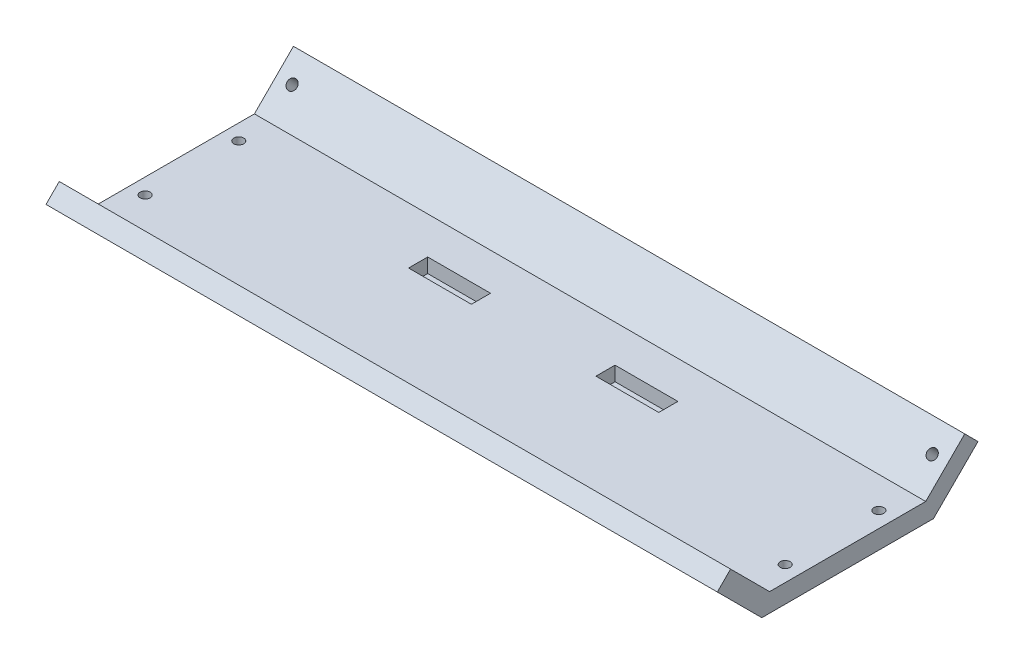
ISO-10303-21;
HEADER;
FILE_DESCRIPTION(('STEP AP214'),'2;1');
FILE_NAME('part.step','',(''),(''),'','','');
FILE_SCHEMA(('AUTOMOTIVE_DESIGN { 1 0 10303 214 1 1 1 1 }'));
ENDSEC;
DATA;
#1=APPLICATION_CONTEXT('core data for automotive mechanical design processes');
#2=APPLICATION_PROTOCOL_DEFINITION('international standard','automotive_design',2000,#1);
#3=PRODUCT_CONTEXT('',#1,'mechanical');
#4=PRODUCT('Part','Part','',(#3));
#5=PRODUCT_RELATED_PRODUCT_CATEGORY('part','',(#4));
#6=PRODUCT_DEFINITION_FORMATION('','',#4);
#7=PRODUCT_DEFINITION_CONTEXT('part definition',#1,'design');
#8=PRODUCT_DEFINITION('design','',#6,#7);
#9=PRODUCT_DEFINITION_SHAPE('','',#8);
#10=(LENGTH_UNIT() NAMED_UNIT(*) SI_UNIT(.MILLI.,.METRE.));
#11=(NAMED_UNIT(*) PLANE_ANGLE_UNIT() SI_UNIT($,.RADIAN.));
#12=(NAMED_UNIT(*) SI_UNIT($,.STERADIAN.) SOLID_ANGLE_UNIT());
#13=UNCERTAINTY_MEASURE_WITH_UNIT(LENGTH_MEASURE(1.E-05),#10,'distance_accuracy_value','');
#14=(GEOMETRIC_REPRESENTATION_CONTEXT(3) GLOBAL_UNCERTAINTY_ASSIGNED_CONTEXT((#13)) GLOBAL_UNIT_ASSIGNED_CONTEXT((#10,
#11,#12)) REPRESENTATION_CONTEXT('',''));
#15=CARTESIAN_POINT('',(0.,0.,0.));
#16=DIRECTION('',(0.,0.,1.));
#17=DIRECTION('',(1.,0.,0.));
#18=AXIS2_PLACEMENT_3D('',#15,#16,#17);
#19=CARTESIAN_POINT('',(-19.9375,-6.,-13.0625));
#20=DIRECTION('',(1.,0.,0.));
#21=DIRECTION('',(0.,0.,-1.));
#22=AXIS2_PLACEMENT_3D('',#19,#20,#21);
#23=PLANE('',#22);
#24=DIRECTION('',(0.,0.,1.));
#25=VECTOR('',#24,1.);
#26=CARTESIAN_POINT('',(-19.9375,-4.6,-13.0625));
#27=LINE('',#26,#25);
#28=CARTESIAN_POINT('',(-19.9375,-4.6,-13.0625));
#29=VERTEX_POINT('',#28);
#30=CARTESIAN_POINT('',(-19.9375,-4.6,-6.9375));
#31=VERTEX_POINT('',#30);
#32=EDGE_CURVE('E54',#29,#31,#27,.T.);
#33=ORIENTED_EDGE('',*,*,#32,.T.);
#34=DIRECTION('',(0.,1.,0.));
#35=VECTOR('',#34,1.);
#36=CARTESIAN_POINT('',(-19.9375,-6.,-6.9375));
#37=LINE('',#36,#35);
#38=CARTESIAN_POINT('',(-19.9375,0.,-6.9375));
#39=VERTEX_POINT('',#38);
#40=EDGE_CURVE('E184',#31,#39,#37,.T.);
#41=ORIENTED_EDGE('',*,*,#40,.T.);
#42=DIRECTION('',(0.,0.,-1.));
#43=VECTOR('',#42,1.);
#44=CARTESIAN_POINT('',(-19.9375,0.,-13.0625));
#45=LINE('',#44,#43);
#46=CARTESIAN_POINT('',(-19.9375,0.,-13.0625));
#47=VERTEX_POINT('',#46);
#48=EDGE_CURVE('E189',#39,#47,#45,.T.);
#49=ORIENTED_EDGE('',*,*,#48,.T.);
#50=DIRECTION('',(0.,1.,0.));
#51=VECTOR('',#50,1.);
#52=CARTESIAN_POINT('',(-19.9375,-6.,-13.0625));
#53=LINE('',#52,#51);
#54=EDGE_CURVE('E162',#29,#47,#53,.T.);
#55=ORIENTED_EDGE('',*,*,#54,.F.);
#56=EDGE_LOOP('',(#33,#41,#49,#55));
#57=FACE_BOUND('',#56,.T.);
#58=ADVANCED_FACE('F39',(#57),#23,.F.);
#59=CARTESIAN_POINT('',(-40.0625,-6.,-6.9375));
#60=DIRECTION('',(0.,0.,1.));
#61=DIRECTION('',(0.,-1.,0.));
#62=AXIS2_PLACEMENT_3D('',#59,#60,#61);
#63=PLANE('',#62);
#64=DIRECTION('',(-1.,0.,0.));
#65=VECTOR('',#64,1.);
#66=CARTESIAN_POINT('',(-19.9375,-4.6,-6.9375));
#67=LINE('',#66,#65);
#68=CARTESIAN_POINT('',(-40.0625,-4.6,-6.9375));
#69=VERTEX_POINT('',#68);
#70=EDGE_CURVE('E61',#31,#69,#67,.T.);
#71=ORIENTED_EDGE('',*,*,#70,.T.);
#72=DIRECTION('',(0.,1.,0.));
#73=VECTOR('',#72,1.);
#74=CARTESIAN_POINT('',(-40.0625,-6.,-6.9375));
#75=LINE('',#74,#73);
#76=CARTESIAN_POINT('',(-40.0625,0.,-6.9375));
#77=VERTEX_POINT('',#76);
#78=EDGE_CURVE('E163',#69,#77,#75,.T.);
#79=ORIENTED_EDGE('',*,*,#78,.T.);
#80=DIRECTION('',(1.,0.,0.));
#81=VECTOR('',#80,1.);
#82=CARTESIAN_POINT('',(-40.0625,0.,-6.9375));
#83=LINE('',#82,#81);
#84=EDGE_CURVE('E207',#77,#39,#83,.T.);
#85=ORIENTED_EDGE('',*,*,#84,.T.);
#86=ORIENTED_EDGE('',*,*,#40,.F.);
#87=EDGE_LOOP('',(#71,#79,#85,#86));
#88=FACE_BOUND('',#87,.T.);
#89=ADVANCED_FACE('F373',(#88),#63,.F.);
#90=CARTESIAN_POINT('',(-40.0625,-6.,-13.0625));
#91=DIRECTION('',(-1.,0.,0.));
#92=DIRECTION('',(0.,0.,1.));
#93=AXIS2_PLACEMENT_3D('',#90,#91,#92);
#94=PLANE('',#93);
#95=DIRECTION('',(0.,0.,-1.));
#96=VECTOR('',#95,1.);
#97=CARTESIAN_POINT('',(-40.0625,-4.6,-13.0625));
#98=LINE('',#97,#96);
#99=CARTESIAN_POINT('',(-40.0625,-4.6,-13.0625));
#100=VERTEX_POINT('',#99);
#101=EDGE_CURVE('E166',#69,#100,#98,.T.);
#102=ORIENTED_EDGE('',*,*,#101,.T.);
#103=DIRECTION('',(0.,1.,0.));
#104=VECTOR('',#103,1.);
#105=CARTESIAN_POINT('',(-40.0625,-6.,-13.0625));
#106=LINE('',#105,#104);
#107=CARTESIAN_POINT('',(-40.0625,0.,-13.0625));
#108=VERTEX_POINT('',#107);
#109=EDGE_CURVE('E152',#100,#108,#106,.T.);
#110=ORIENTED_EDGE('',*,*,#109,.T.);
#111=DIRECTION('',(0.,0.,1.));
#112=VECTOR('',#111,1.);
#113=CARTESIAN_POINT('',(-40.0625,0.,-13.0625));
#114=LINE('',#113,#112);
#115=EDGE_CURVE('E213',#108,#77,#114,.T.);
#116=ORIENTED_EDGE('',*,*,#115,.T.);
#117=ORIENTED_EDGE('',*,*,#78,.F.);
#118=EDGE_LOOP('',(#102,#110,#116,#117));
#119=FACE_BOUND('',#118,.T.);
#120=ADVANCED_FACE('F167',(#119),#94,.F.);
#121=CARTESIAN_POINT('',(-40.0625,-6.,-13.0625));
#122=DIRECTION('',(0.,0.,-1.));
#123=DIRECTION('',(0.,1.,0.));
#124=AXIS2_PLACEMENT_3D('',#121,#122,#123);
#125=PLANE('',#124);
#126=DIRECTION('',(1.,0.,0.));
#127=VECTOR('',#126,1.);
#128=CARTESIAN_POINT('',(-19.9375,-4.6,-13.0625));
#129=LINE('',#128,#127);
#130=EDGE_CURVE('E156',#100,#29,#129,.T.);
#131=ORIENTED_EDGE('',*,*,#130,.T.);
#132=ORIENTED_EDGE('',*,*,#54,.T.);
#133=DIRECTION('',(-1.,0.,0.));
#134=VECTOR('',#133,1.);
#135=CARTESIAN_POINT('',(-40.0625,0.,-13.0625));
#136=LINE('',#135,#134);
#137=EDGE_CURVE('E158',#47,#108,#136,.T.);
#138=ORIENTED_EDGE('',*,*,#137,.T.);
#139=ORIENTED_EDGE('',*,*,#109,.F.);
#140=EDGE_LOOP('',(#131,#132,#138,#139));
#141=FACE_BOUND('',#140,.T.);
#142=ADVANCED_FACE('F154',(#141),#125,.F.);
#143=CARTESIAN_POINT('',(40.0625,-6.,-13.0625));
#144=DIRECTION('',(1.,0.,0.));
#145=DIRECTION('',(0.,0.,-1.));
#146=AXIS2_PLACEMENT_3D('',#143,#144,#145);
#147=PLANE('',#146);
#148=DIRECTION('',(0.,0.,1.));
#149=VECTOR('',#148,1.);
#150=CARTESIAN_POINT('',(40.0625,-4.6,-13.0625));
#151=LINE('',#150,#149);
#152=CARTESIAN_POINT('',(40.0625,-4.6,-13.0625));
#153=VERTEX_POINT('',#152);
#154=CARTESIAN_POINT('',(40.0625,-4.6,-6.9375));
#155=VERTEX_POINT('',#154);
#156=EDGE_CURVE('E175',#153,#155,#151,.T.);
#157=ORIENTED_EDGE('',*,*,#156,.T.);
#158=DIRECTION('',(0.,1.,0.));
#159=VECTOR('',#158,1.);
#160=CARTESIAN_POINT('',(40.0625,-6.,-6.9375));
#161=LINE('',#160,#159);
#162=CARTESIAN_POINT('',(40.0625,0.,-6.9375));
#163=VERTEX_POINT('',#162);
#164=EDGE_CURVE('E199',#155,#163,#161,.T.);
#165=ORIENTED_EDGE('',*,*,#164,.T.);
#166=DIRECTION('',(0.,0.,-1.));
#167=VECTOR('',#166,1.);
#168=CARTESIAN_POINT('',(40.0625,0.,-13.0625));
#169=LINE('',#168,#167);
#170=CARTESIAN_POINT('',(40.0625,0.,-13.0625));
#171=VERTEX_POINT('',#170);
#172=EDGE_CURVE('E185',#163,#171,#169,.T.);
#173=ORIENTED_EDGE('',*,*,#172,.T.);
#174=DIRECTION('',(0.,1.,0.));
#175=VECTOR('',#174,1.);
#176=CARTESIAN_POINT('',(40.0625,-6.,-13.0625));
#177=LINE('',#176,#175);
#178=EDGE_CURVE('E198',#153,#171,#177,.T.);
#179=ORIENTED_EDGE('',*,*,#178,.F.);
#180=EDGE_LOOP('',(#157,#165,#173,#179));
#181=FACE_BOUND('',#180,.T.);
#182=ADVANCED_FACE('F381',(#181),#147,.F.);
#183=CARTESIAN_POINT('',(19.9375,-6.,-6.9375));
#184=DIRECTION('',(0.,0.,1.));
#185=DIRECTION('',(0.,-1.,0.));
#186=AXIS2_PLACEMENT_3D('',#183,#184,#185);
#187=PLANE('',#186);
#188=DIRECTION('',(-1.,0.,0.));
#189=VECTOR('',#188,1.);
#190=CARTESIAN_POINT('',(40.0625,-4.6,-6.9375));
#191=LINE('',#190,#189);
#192=CARTESIAN_POINT('',(19.9375,-4.6,-6.9375));
#193=VERTEX_POINT('',#192);
#194=EDGE_CURVE('E177',#155,#193,#191,.T.);
#195=ORIENTED_EDGE('',*,*,#194,.T.);
#196=DIRECTION('',(0.,1.,0.));
#197=VECTOR('',#196,1.);
#198=CARTESIAN_POINT('',(19.9375,-6.,-6.9375));
#199=LINE('',#198,#197);
#200=CARTESIAN_POINT('',(19.9375,0.,-6.9375));
#201=VERTEX_POINT('',#200);
#202=EDGE_CURVE('E202',#193,#201,#199,.T.);
#203=ORIENTED_EDGE('',*,*,#202,.T.);
#204=DIRECTION('',(1.,0.,0.));
#205=VECTOR('',#204,1.);
#206=CARTESIAN_POINT('',(19.9375,0.,-6.9375));
#207=LINE('',#206,#205);
#208=EDGE_CURVE('E195',#201,#163,#207,.T.);
#209=ORIENTED_EDGE('',*,*,#208,.T.);
#210=ORIENTED_EDGE('',*,*,#164,.F.);
#211=EDGE_LOOP('',(#195,#203,#209,#210));
#212=FACE_BOUND('',#211,.T.);
#213=ADVANCED_FACE('F554',(#212),#187,.F.);
#214=CARTESIAN_POINT('',(19.9375,-6.,-13.0625));
#215=DIRECTION('',(-1.,0.,0.));
#216=DIRECTION('',(0.,0.,1.));
#217=AXIS2_PLACEMENT_3D('',#214,#215,#216);
#218=PLANE('',#217);
#219=DIRECTION('',(0.,0.,-1.));
#220=VECTOR('',#219,1.);
#221=CARTESIAN_POINT('',(19.9375,-4.6,-13.0625));
#222=LINE('',#221,#220);
#223=CARTESIAN_POINT('',(19.9375,-4.6,-13.0625));
#224=VERTEX_POINT('',#223);
#225=EDGE_CURVE('E179',#193,#224,#222,.T.);
#226=ORIENTED_EDGE('',*,*,#225,.T.);
#227=DIRECTION('',(0.,1.,0.));
#228=VECTOR('',#227,1.);
#229=CARTESIAN_POINT('',(19.9375,-6.,-13.0625));
#230=LINE('',#229,#228);
#231=CARTESIAN_POINT('',(19.9375,0.,-13.0625));
#232=VERTEX_POINT('',#231);
#233=EDGE_CURVE('E204',#224,#232,#230,.T.);
#234=ORIENTED_EDGE('',*,*,#233,.T.);
#235=DIRECTION('',(0.,0.,1.));
#236=VECTOR('',#235,1.);
#237=CARTESIAN_POINT('',(19.9375,0.,-13.0625));
#238=LINE('',#237,#236);
#239=EDGE_CURVE('E192',#232,#201,#238,.T.);
#240=ORIENTED_EDGE('',*,*,#239,.T.);
#241=ORIENTED_EDGE('',*,*,#202,.F.);
#242=EDGE_LOOP('',(#226,#234,#240,#241));
#243=FACE_BOUND('',#242,.T.);
#244=ADVANCED_FACE('F546',(#243),#218,.F.);
#245=CARTESIAN_POINT('',(19.9375,-6.,-13.0625));
#246=DIRECTION('',(0.,0.,-1.));
#247=DIRECTION('',(0.,1.,0.));
#248=AXIS2_PLACEMENT_3D('',#245,#246,#247);
#249=PLANE('',#248);
#250=DIRECTION('',(1.,0.,0.));
#251=VECTOR('',#250,1.);
#252=CARTESIAN_POINT('',(40.0625,-4.6,-13.0625));
#253=LINE('',#252,#251);
#254=EDGE_CURVE('E182',#224,#153,#253,.T.);
#255=ORIENTED_EDGE('',*,*,#254,.T.);
#256=ORIENTED_EDGE('',*,*,#178,.T.);
#257=DIRECTION('',(-1.,0.,0.));
#258=VECTOR('',#257,1.);
#259=CARTESIAN_POINT('',(19.9375,0.,-13.0625));
#260=LINE('',#259,#258);
#261=EDGE_CURVE('E188',#171,#232,#260,.T.);
#262=ORIENTED_EDGE('',*,*,#261,.T.);
#263=ORIENTED_EDGE('',*,*,#233,.F.);
#264=EDGE_LOOP('',(#255,#256,#262,#263));
#265=FACE_BOUND('',#264,.T.);
#266=ADVANCED_FACE('F441',(#265),#249,.F.);
#267=CARTESIAN_POINT('',(107.5,12.4999999999999,37.5000000000001));
#268=DIRECTION('',(0.,-0.707106781186547,-0.707106781186548));
#269=DIRECTION('',(0.,0.707106781186548,-0.707106781186547));
#270=AXIS2_PLACEMENT_3D('',#267,#268,#269);
#271=PLANE('',#270);
#272=DIRECTION('',(0.,-0.707106781186548,0.707106781186547));
#273=VECTOR('',#272,1.);
#274=CARTESIAN_POINT('',(-107.5,12.4999999999999,37.5000000000001));
#275=LINE('',#274,#273);
#276=CARTESIAN_POINT('',(-107.5,12.4999999999999,37.5000000000001));
#277=VERTEX_POINT('',#276);
#278=CARTESIAN_POINT('',(-107.5,8.25735931288065,41.7426406871193));
#279=VERTEX_POINT('',#278);
#280=EDGE_CURVE('E265',#277,#279,#275,.T.);
#281=ORIENTED_EDGE('',*,*,#280,.T.);
#282=DIRECTION('',(-1.,0.,0.));
#283=VECTOR('',#282,1.);
#284=CARTESIAN_POINT('',(107.5,8.25735931288065,41.7426406871193));
#285=LINE('',#284,#283);
#286=CARTESIAN_POINT('',(107.5,8.25735931288065,41.7426406871193));
#287=VERTEX_POINT('',#286);
#288=EDGE_CURVE('E11',#287,#279,#285,.T.);
#289=ORIENTED_EDGE('',*,*,#288,.F.);
#290=DIRECTION('',(0.,-0.707106781186548,0.707106781186547));
#291=VECTOR('',#290,1.);
#292=CARTESIAN_POINT('',(107.5,12.4999999999999,37.5000000000001));
#293=LINE('',#292,#291);
#294=CARTESIAN_POINT('',(107.5,12.4999999999999,37.5000000000001));
#295=VERTEX_POINT('',#294);
#296=EDGE_CURVE('E266',#295,#287,#293,.T.);
#297=ORIENTED_EDGE('',*,*,#296,.F.);
#298=DIRECTION('',(-1.,0.,0.));
#299=VECTOR('',#298,1.);
#300=CARTESIAN_POINT('',(107.5,12.4999999999999,37.5000000000001));
#301=LINE('',#300,#299);
#302=EDGE_CURVE('E284',#295,#277,#301,.T.);
#303=ORIENTED_EDGE('',*,*,#302,.T.);
#304=EDGE_LOOP('',(#281,#289,#297,#303));
#305=FACE_BOUND('',#304,.T.);
#306=ADVANCED_FACE('F41',(#305),#271,.F.);
#307=CARTESIAN_POINT('',(107.5,-6.,27.4852813742388));
#308=DIRECTION('',(0.,0.707106781186544,-0.707106781186551));
#309=DIRECTION('',(0.,0.707106781186551,0.707106781186544));
#310=AXIS2_PLACEMENT_3D('',#307,#308,#309);
#311=PLANE('',#310);
#312=CARTESIAN_POINT('',(-102.5,2.8284271247461,36.3137084989848));
#313=DIRECTION('',(0.,0.707106781186544,-0.707106781186551));
#314=DIRECTION('',(0.,0.707106781186551,0.707106781186544));
#315=AXIS2_PLACEMENT_3D('',#312,#313,#314);
#316=CIRCLE('',#315,1.6);
#317=CARTESIAN_POINT('',(-102.5,3.95979797464459,37.4450793488833));
#318=VERTEX_POINT('',#317);
#319=EDGE_CURVE('E238',#318,#318,#316,.T.);
#320=ORIENTED_EDGE('',*,*,#319,.T.);
#321=EDGE_LOOP('',(#320));
#322=FACE_BOUND('',#321,.T.);
#323=CARTESIAN_POINT('',(102.5,2.8284271247461,36.3137084989848));
#324=DIRECTION('',(0.,0.707106781186544,-0.707106781186551));
#325=DIRECTION('',(0.,0.707106781186551,0.707106781186544));
#326=AXIS2_PLACEMENT_3D('',#323,#324,#325);
#327=CIRCLE('',#326,1.6);
#328=CARTESIAN_POINT('',(102.5,3.95979797464459,37.4450793488833));
#329=VERTEX_POINT('',#328);
#330=EDGE_CURVE('E244',#329,#329,#327,.T.);
#331=ORIENTED_EDGE('',*,*,#330,.T.);
#332=EDGE_LOOP('',(#331));
#333=FACE_BOUND('',#332,.T.);
#334=DIRECTION('',(0.,-0.707106781186551,-0.707106781186544));
#335=VECTOR('',#334,1.);
#336=CARTESIAN_POINT('',(-107.5,-6.,27.4852813742388));
#337=LINE('',#336,#335);
#338=CARTESIAN_POINT('',(-107.5,-6.,27.4852813742388));
#339=VERTEX_POINT('',#338);
#340=EDGE_CURVE('E287',#279,#339,#337,.T.);
#341=ORIENTED_EDGE('',*,*,#340,.T.);
#342=DIRECTION('',(-1.,0.,0.));
#343=VECTOR('',#342,1.);
#344=CARTESIAN_POINT('',(107.5,-6.,27.4852813742388));
#345=LINE('',#344,#343);
#346=CARTESIAN_POINT('',(107.5,-6.,27.4852813742388));
#347=VERTEX_POINT('',#346);
#348=EDGE_CURVE('E47',#347,#339,#345,.T.);
#349=ORIENTED_EDGE('',*,*,#348,.F.);
#350=DIRECTION('',(0.,-0.707106781186551,-0.707106781186544));
#351=VECTOR('',#350,1.);
#352=CARTESIAN_POINT('',(107.5,-6.,27.4852813742388));
#353=LINE('',#352,#351);
#354=EDGE_CURVE('E269',#287,#347,#353,.T.);
#355=ORIENTED_EDGE('',*,*,#354,.F.);
#356=ORIENTED_EDGE('',*,*,#288,.T.);
#357=EDGE_LOOP('',(#341,#349,#355,#356));
#358=FACE_BOUND('',#357,.T.);
#359=ADVANCED_FACE('F344',(#322,#333,#358),#311,.F.);
#360=CARTESIAN_POINT('',(107.5,-6.,27.4852813742388));
#361=DIRECTION('',(0.,1.,0.));
#362=DIRECTION('',(0.,0.,1.));
#363=AXIS2_PLACEMENT_3D('',#360,#361,#362);
#364=PLANE('',#363);
#365=CARTESIAN_POINT('',(-102.5,-6.,-15.0000000000001));
#366=DIRECTION('',(0.,1.,0.));
#367=DIRECTION('',(0.,0.,1.));
#368=AXIS2_PLACEMENT_3D('',#365,#366,#367);
#369=CIRCLE('',#368,1.6);
#370=CARTESIAN_POINT('',(-102.5,-6.,-13.4000000000001));
#371=VERTEX_POINT('',#370);
#372=EDGE_CURVE('E226',#371,#371,#369,.T.);
#373=ORIENTED_EDGE('',*,*,#372,.T.);
#374=EDGE_LOOP('',(#373));
#375=FACE_BOUND('',#374,.T.);
#376=CARTESIAN_POINT('',(-102.5,-6.,15.0000000000001));
#377=DIRECTION('',(0.,1.,0.));
#378=DIRECTION('',(0.,0.,1.));
#379=AXIS2_PLACEMENT_3D('',#376,#377,#378);
#380=CIRCLE('',#379,1.6);
#381=CARTESIAN_POINT('',(-102.5,-6.,16.6000000000001));
#382=VERTEX_POINT('',#381);
#383=EDGE_CURVE('E232',#382,#382,#380,.T.);
#384=ORIENTED_EDGE('',*,*,#383,.T.);
#385=EDGE_LOOP('',(#384));
#386=FACE_BOUND('',#385,.T.);
#387=CARTESIAN_POINT('',(102.5,-6.,15.0000000000001));
#388=DIRECTION('',(0.,1.,0.));
#389=DIRECTION('',(0.,0.,1.));
#390=AXIS2_PLACEMENT_3D('',#387,#388,#389);
#391=CIRCLE('',#390,1.6);
#392=CARTESIAN_POINT('',(102.5,-6.,16.6000000000001));
#393=VERTEX_POINT('',#392);
#394=EDGE_CURVE('E250',#393,#393,#391,.T.);
#395=ORIENTED_EDGE('',*,*,#394,.T.);
#396=EDGE_LOOP('',(#395));
#397=FACE_BOUND('',#396,.T.);
#398=CARTESIAN_POINT('',(102.5,-6.,-15.0000000000001));
#399=DIRECTION('',(0.,1.,0.));
#400=DIRECTION('',(0.,0.,1.));
#401=AXIS2_PLACEMENT_3D('',#398,#399,#400);
#402=CIRCLE('',#401,1.6);
#403=CARTESIAN_POINT('',(102.5,-6.,-13.4000000000001));
#404=VERTEX_POINT('',#403);
#405=EDGE_CURVE('E256',#404,#404,#402,.T.);
#406=ORIENTED_EDGE('',*,*,#405,.T.);
#407=EDGE_LOOP('',(#406));
#408=FACE_BOUND('',#407,.T.);
#409=DIRECTION('',(0.,0.,-1.));
#410=VECTOR('',#409,1.);
#411=CARTESIAN_POINT('',(-107.5,-6.,27.4852813742388));
#412=LINE('',#411,#410);
#413=CARTESIAN_POINT('',(-107.5,-6.,-27.4852813742387));
#414=VERTEX_POINT('',#413);
#415=EDGE_CURVE('E289',#339,#414,#412,.T.);
#416=ORIENTED_EDGE('',*,*,#415,.T.);
#417=DIRECTION('',(-1.,0.,0.));
#418=VECTOR('',#417,1.);
#419=CARTESIAN_POINT('',(107.5,-6.,-27.4852813742387));
#420=LINE('',#419,#418);
#421=CARTESIAN_POINT('',(107.5,-6.,-27.4852813742387));
#422=VERTEX_POINT('',#421);
#423=EDGE_CURVE('E314',#422,#414,#420,.T.);
#424=ORIENTED_EDGE('',*,*,#423,.F.);
#425=DIRECTION('',(0.,0.,-1.));
#426=VECTOR('',#425,1.);
#427=CARTESIAN_POINT('',(107.5,-6.,27.4852813742388));
#428=LINE('',#427,#426);
#429=EDGE_CURVE('E272',#347,#422,#428,.T.);
#430=ORIENTED_EDGE('',*,*,#429,.F.);
#431=ORIENTED_EDGE('',*,*,#348,.T.);
#432=EDGE_LOOP('',(#416,#424,#430,#431));
#433=FACE_BOUND('',#432,.T.);
#434=ADVANCED_FACE('F321',(#375,#386,#397,#408,#433),#364,.F.);
#435=CARTESIAN_POINT('',(107.5,-6.,-27.4852813742387));
#436=DIRECTION('',(0.,0.707106781186547,0.707106781186548));
#437=DIRECTION('',(0.,-0.707106781186548,0.707106781186547));
#438=AXIS2_PLACEMENT_3D('',#435,#436,#437);
#439=PLANE('',#438);
#440=CARTESIAN_POINT('',(-102.5,2.82842712474617,-36.3137084989848));
#441=DIRECTION('',(0.,0.707106781186547,0.707106781186548));
#442=DIRECTION('',(0.,-0.707106781186548,0.707106781186547));
#443=AXIS2_PLACEMENT_3D('',#440,#441,#442);
#444=CIRCLE('',#443,1.6);
#445=CARTESIAN_POINT('',(-102.5,1.69705627484769,-35.1823376490863));
#446=VERTEX_POINT('',#445);
#447=EDGE_CURVE('E220',#446,#446,#444,.T.);
#448=ORIENTED_EDGE('',*,*,#447,.T.);
#449=EDGE_LOOP('',(#448));
#450=FACE_BOUND('',#449,.T.);
#451=CARTESIAN_POINT('',(102.5,2.82842712474615,-36.3137084989848));
#452=DIRECTION('',(0.,0.707106781186547,0.707106781186548));
#453=DIRECTION('',(0.,-0.707106781186548,0.707106781186547));
#454=AXIS2_PLACEMENT_3D('',#451,#452,#453);
#455=CIRCLE('',#454,1.6);
#456=CARTESIAN_POINT('',(102.5,1.69705627484767,-35.1823376490863));
#457=VERTEX_POINT('',#456);
#458=EDGE_CURVE('E262',#457,#457,#455,.T.);
#459=ORIENTED_EDGE('',*,*,#458,.T.);
#460=EDGE_LOOP('',(#459));
#461=FACE_BOUND('',#460,.T.);
#462=DIRECTION('',(0.,0.707106781186548,-0.707106781186547));
#463=VECTOR('',#462,1.);
#464=CARTESIAN_POINT('',(-107.5,-6.,-27.4852813742387));
#465=LINE('',#464,#463);
#466=CARTESIAN_POINT('',(-107.5,8.25735931288064,-41.7426406871193));
#467=VERTEX_POINT('',#466);
#468=EDGE_CURVE('E291',#414,#467,#465,.T.);
#469=ORIENTED_EDGE('',*,*,#468,.T.);
#470=DIRECTION('',(-1.,0.,0.));
#471=VECTOR('',#470,1.);
#472=CARTESIAN_POINT('',(107.5,8.25735931288064,-41.7426406871193));
#473=LINE('',#472,#471);
#474=CARTESIAN_POINT('',(107.5,8.25735931288064,-41.7426406871193));
#475=VERTEX_POINT('',#474);
#476=EDGE_CURVE('E311',#475,#467,#473,.T.);
#477=ORIENTED_EDGE('',*,*,#476,.F.);
#478=DIRECTION('',(0.,0.707106781186548,-0.707106781186547));
#479=VECTOR('',#478,1.);
#480=CARTESIAN_POINT('',(107.5,-6.,-27.4852813742387));
#481=LINE('',#480,#479);
#482=EDGE_CURVE('E274',#422,#475,#481,.T.);
#483=ORIENTED_EDGE('',*,*,#482,.F.);
#484=ORIENTED_EDGE('',*,*,#423,.T.);
#485=EDGE_LOOP('',(#469,#477,#483,#484));
#486=FACE_BOUND('',#485,.T.);
#487=ADVANCED_FACE('F332',(#450,#461,#486),#439,.F.);
#488=CARTESIAN_POINT('',(107.5,12.5,-37.5));
#489=DIRECTION('',(0.,-0.707106781186547,0.707106781186548));
#490=DIRECTION('',(0.,-0.707106781186548,-0.707106781186547));
#491=AXIS2_PLACEMENT_3D('',#488,#489,#490);
#492=PLANE('',#491);
#493=DIRECTION('',(0.,0.707106781186548,0.707106781186547));
#494=VECTOR('',#493,1.);
#495=CARTESIAN_POINT('',(-107.5,12.5,-37.5));
#496=LINE('',#495,#494);
#497=CARTESIAN_POINT('',(-107.5,12.5,-37.5));
#498=VERTEX_POINT('',#497);
#499=EDGE_CURVE('E293',#467,#498,#496,.T.);
#500=ORIENTED_EDGE('',*,*,#499,.T.);
#501=DIRECTION('',(-1.,0.,0.));
#502=VECTOR('',#501,1.);
#503=CARTESIAN_POINT('',(107.5,12.5,-37.5));
#504=LINE('',#503,#502);
#505=CARTESIAN_POINT('',(107.5,12.5,-37.5));
#506=VERTEX_POINT('',#505);
#507=EDGE_CURVE('E308',#506,#498,#504,.T.);
#508=ORIENTED_EDGE('',*,*,#507,.F.);
#509=DIRECTION('',(0.,0.707106781186548,0.707106781186547));
#510=VECTOR('',#509,1.);
#511=CARTESIAN_POINT('',(107.5,12.5,-37.5));
#512=LINE('',#511,#510);
#513=EDGE_CURVE('E276',#475,#506,#512,.T.);
#514=ORIENTED_EDGE('',*,*,#513,.F.);
#515=ORIENTED_EDGE('',*,*,#476,.T.);
#516=EDGE_LOOP('',(#500,#508,#514,#515));
#517=FACE_BOUND('',#516,.T.);
#518=ADVANCED_FACE('F336',(#517),#492,.F.);
#519=CARTESIAN_POINT('',(107.5,0.,-25.0000000000001));
#520=DIRECTION('',(0.,-0.707106781186546,-0.707106781186549));
#521=DIRECTION('',(0.,0.707106781186549,-0.707106781186546));
#522=AXIS2_PLACEMENT_3D('',#519,#520,#521);
#523=PLANE('',#522);
#524=CARTESIAN_POINT('',(-102.5,7.07106781186545,-32.0710678118655));
#525=DIRECTION('',(0.,0.707106781186546,0.707106781186549));
#526=DIRECTION('',(0.,-0.707106781186549,0.707106781186546));
#527=AXIS2_PLACEMENT_3D('',#524,#525,#526);
#528=CIRCLE('',#527,1.6);
#529=CARTESIAN_POINT('',(-102.5,5.93969696196697,-30.9396969619671));
#530=VERTEX_POINT('',#529);
#531=EDGE_CURVE('E201',#530,#530,#528,.T.);
#532=ORIENTED_EDGE('',*,*,#531,.F.);
#533=EDGE_LOOP('',(#532));
#534=FACE_BOUND('',#533,.T.);
#535=CARTESIAN_POINT('',(102.5,7.07106781186544,-32.0710678118655));
#536=DIRECTION('',(0.,0.707106781186546,0.707106781186549));
#537=DIRECTION('',(0.,-0.707106781186549,0.707106781186546));
#538=AXIS2_PLACEMENT_3D('',#535,#536,#537);
#539=CIRCLE('',#538,1.6);
#540=CARTESIAN_POINT('',(102.5,5.93969696196696,-30.939696961967));
#541=VERTEX_POINT('',#540);
#542=EDGE_CURVE('E259',#541,#541,#539,.T.);
#543=ORIENTED_EDGE('',*,*,#542,.F.);
#544=EDGE_LOOP('',(#543));
#545=FACE_BOUND('',#544,.T.);
#546=DIRECTION('',(0.,-0.707106781186549,0.707106781186546));
#547=VECTOR('',#546,1.);
#548=CARTESIAN_POINT('',(-107.5,0.,-25.0000000000001));
#549=LINE('',#548,#547);
#550=CARTESIAN_POINT('',(-107.5,0.,-25.0000000000001));
#551=VERTEX_POINT('',#550);
#552=EDGE_CURVE('E295',#498,#551,#549,.T.);
#553=ORIENTED_EDGE('',*,*,#552,.T.);
#554=DIRECTION('',(-1.,0.,0.));
#555=VECTOR('',#554,1.);
#556=CARTESIAN_POINT('',(107.5,0.,-25.0000000000001));
#557=LINE('',#556,#555);
#558=CARTESIAN_POINT('',(107.5,0.,-25.0000000000001));
#559=VERTEX_POINT('',#558);
#560=EDGE_CURVE('E305',#559,#551,#557,.T.);
#561=ORIENTED_EDGE('',*,*,#560,.F.);
#562=DIRECTION('',(0.,-0.707106781186549,0.707106781186546));
#563=VECTOR('',#562,1.);
#564=CARTESIAN_POINT('',(107.5,0.,-25.0000000000001));
#565=LINE('',#564,#563);
#566=EDGE_CURVE('E278',#506,#559,#565,.T.);
#567=ORIENTED_EDGE('',*,*,#566,.F.);
#568=ORIENTED_EDGE('',*,*,#507,.T.);
#569=EDGE_LOOP('',(#553,#561,#567,#568));
#570=FACE_BOUND('',#569,.T.);
#571=ADVANCED_FACE('F357',(#534,#545,#570),#523,.F.);
#572=CARTESIAN_POINT('',(107.5,0.,25.0000000000001));
#573=DIRECTION('',(0.,-1.,0.));
#574=DIRECTION('',(0.,0.,-1.));
#575=AXIS2_PLACEMENT_3D('',#572,#573,#574);
#576=PLANE('',#575);
#577=ORIENTED_EDGE('',*,*,#261,.F.);
#578=ORIENTED_EDGE('',*,*,#172,.F.);
#579=ORIENTED_EDGE('',*,*,#208,.F.);
#580=ORIENTED_EDGE('',*,*,#239,.F.);
#581=EDGE_LOOP('',(#577,#578,#579,#580));
#582=FACE_BOUND('',#581,.T.);
#583=ORIENTED_EDGE('',*,*,#137,.F.);
#584=ORIENTED_EDGE('',*,*,#48,.F.);
#585=ORIENTED_EDGE('',*,*,#84,.F.);
#586=ORIENTED_EDGE('',*,*,#115,.F.);
#587=EDGE_LOOP('',(#583,#584,#585,#586));
#588=FACE_BOUND('',#587,.T.);
#589=CARTESIAN_POINT('',(-102.5,0.,-15.0000000000001));
#590=DIRECTION('',(0.,1.,0.));
#591=DIRECTION('',(0.,0.,1.));
#592=AXIS2_PLACEMENT_3D('',#589,#590,#591);
#593=CIRCLE('',#592,1.6);
#594=CARTESIAN_POINT('',(-102.5,0.,-13.4000000000001));
#595=VERTEX_POINT('',#594);
#596=EDGE_CURVE('E223',#595,#595,#593,.T.);
#597=ORIENTED_EDGE('',*,*,#596,.F.);
#598=EDGE_LOOP('',(#597));
#599=FACE_BOUND('',#598,.T.);
#600=CARTESIAN_POINT('',(-102.5,0.,15.0000000000001));
#601=DIRECTION('',(0.,1.,0.));
#602=DIRECTION('',(0.,0.,1.));
#603=AXIS2_PLACEMENT_3D('',#600,#601,#602);
#604=CIRCLE('',#603,1.6);
#605=CARTESIAN_POINT('',(-102.5,0.,16.6000000000001));
#606=VERTEX_POINT('',#605);
#607=EDGE_CURVE('E229',#606,#606,#604,.T.);
#608=ORIENTED_EDGE('',*,*,#607,.F.);
#609=EDGE_LOOP('',(#608));
#610=FACE_BOUND('',#609,.T.);
#611=CARTESIAN_POINT('',(102.5,0.,15.0000000000001));
#612=DIRECTION('',(0.,1.,0.));
#613=DIRECTION('',(0.,0.,1.));
#614=AXIS2_PLACEMENT_3D('',#611,#612,#613);
#615=CIRCLE('',#614,1.6);
#616=CARTESIAN_POINT('',(102.5,0.,16.6000000000001));
#617=VERTEX_POINT('',#616);
#618=EDGE_CURVE('E247',#617,#617,#615,.T.);
#619=ORIENTED_EDGE('',*,*,#618,.F.);
#620=EDGE_LOOP('',(#619));
#621=FACE_BOUND('',#620,.T.);
#622=CARTESIAN_POINT('',(102.5,0.,-15.0000000000001));
#623=DIRECTION('',(0.,1.,0.));
#624=DIRECTION('',(0.,0.,1.));
#625=AXIS2_PLACEMENT_3D('',#622,#623,#624);
#626=CIRCLE('',#625,1.6);
#627=CARTESIAN_POINT('',(102.5,0.,-13.4000000000001));
#628=VERTEX_POINT('',#627);
#629=EDGE_CURVE('E253',#628,#628,#626,.T.);
#630=ORIENTED_EDGE('',*,*,#629,.F.);
#631=EDGE_LOOP('',(#630));
#632=FACE_BOUND('',#631,.T.);
#633=DIRECTION('',(0.,0.,1.));
#634=VECTOR('',#633,1.);
#635=CARTESIAN_POINT('',(-107.5,0.,25.0000000000001));
#636=LINE('',#635,#634);
#637=CARTESIAN_POINT('',(-107.5,0.,25.0000000000001));
#638=VERTEX_POINT('',#637);
#639=EDGE_CURVE('E297',#551,#638,#636,.T.);
#640=ORIENTED_EDGE('',*,*,#639,.T.);
#641=DIRECTION('',(-1.,0.,0.));
#642=VECTOR('',#641,1.);
#643=CARTESIAN_POINT('',(107.5,0.,25.0000000000001));
#644=LINE('',#643,#642);
#645=CARTESIAN_POINT('',(107.5,0.,25.0000000000001));
#646=VERTEX_POINT('',#645);
#647=EDGE_CURVE('E302',#646,#638,#644,.T.);
#648=ORIENTED_EDGE('',*,*,#647,.F.);
#649=DIRECTION('',(0.,0.,1.));
#650=VECTOR('',#649,1.);
#651=CARTESIAN_POINT('',(107.5,0.,25.0000000000001));
#652=LINE('',#651,#650);
#653=EDGE_CURVE('E280',#559,#646,#652,.T.);
#654=ORIENTED_EDGE('',*,*,#653,.F.);
#655=ORIENTED_EDGE('',*,*,#560,.T.);
#656=EDGE_LOOP('',(#640,#648,#654,#655));
#657=FACE_BOUND('',#656,.T.);
#658=ADVANCED_FACE('F355',(#582,#588,#599,#610,#621,#632,#657),#576,.F.);
#659=CARTESIAN_POINT('',(107.5,0.,25.0000000000001));
#660=DIRECTION('',(0.,-0.707106781186551,0.707106781186544));
#661=DIRECTION('',(0.,-0.707106781186544,-0.707106781186551));
#662=AXIS2_PLACEMENT_3D('',#659,#660,#661);
#663=PLANE('',#662);
#664=CARTESIAN_POINT('',(-102.5,7.0710678118654,32.0710678118656));
#665=DIRECTION('',(0.,0.707106781186551,-0.707106781186544));
#666=DIRECTION('',(0.,0.707106781186544,0.707106781186551));
#667=AXIS2_PLACEMENT_3D('',#664,#665,#666);
#668=CIRCLE('',#667,1.6);
#669=CARTESIAN_POINT('',(-102.5,8.20243866176387,33.202438661764));
#670=VERTEX_POINT('',#669);
#671=EDGE_CURVE('E235',#670,#670,#668,.T.);
#672=ORIENTED_EDGE('',*,*,#671,.F.);
#673=EDGE_LOOP('',(#672));
#674=FACE_BOUND('',#673,.T.);
#675=CARTESIAN_POINT('',(102.5,7.0710678118654,32.0710678118656));
#676=DIRECTION('',(0.,0.707106781186551,-0.707106781186544));
#677=DIRECTION('',(0.,0.707106781186544,0.707106781186551));
#678=AXIS2_PLACEMENT_3D('',#675,#676,#677);
#679=CIRCLE('',#678,1.6);
#680=CARTESIAN_POINT('',(102.5,8.20243866176387,33.202438661764));
#681=VERTEX_POINT('',#680);
#682=EDGE_CURVE('E241',#681,#681,#679,.T.);
#683=ORIENTED_EDGE('',*,*,#682,.F.);
#684=EDGE_LOOP('',(#683));
#685=FACE_BOUND('',#684,.T.);
#686=DIRECTION('',(0.,0.707106781186544,0.707106781186551));
#687=VECTOR('',#686,1.);
#688=CARTESIAN_POINT('',(-107.5,0.,25.0000000000001));
#689=LINE('',#688,#687);
#690=EDGE_CURVE('E270',#638,#277,#689,.T.);
#691=ORIENTED_EDGE('',*,*,#690,.T.);
#692=ORIENTED_EDGE('',*,*,#302,.F.);
#693=DIRECTION('',(0.,0.707106781186544,0.707106781186551));
#694=VECTOR('',#693,1.);
#695=CARTESIAN_POINT('',(107.5,0.,25.0000000000001));
#696=LINE('',#695,#694);
#697=EDGE_CURVE('E282',#646,#295,#696,.T.);
#698=ORIENTED_EDGE('',*,*,#697,.F.);
#699=ORIENTED_EDGE('',*,*,#647,.T.);
#700=EDGE_LOOP('',(#691,#692,#698,#699));
#701=FACE_BOUND('',#700,.T.);
#702=ADVANCED_FACE('F350',(#674,#685,#701),#663,.F.);
#703=CARTESIAN_POINT('',(107.5,0.,0.));
#704=DIRECTION('',(-1.,0.,0.));
#705=DIRECTION('',(0.,0.,1.));
#706=AXIS2_PLACEMENT_3D('',#703,#704,#705);
#707=PLANE('',#706);
#708=ORIENTED_EDGE('',*,*,#296,.T.);
#709=ORIENTED_EDGE('',*,*,#354,.T.);
#710=ORIENTED_EDGE('',*,*,#429,.T.);
#711=ORIENTED_EDGE('',*,*,#482,.T.);
#712=ORIENTED_EDGE('',*,*,#513,.T.);
#713=ORIENTED_EDGE('',*,*,#566,.T.);
#714=ORIENTED_EDGE('',*,*,#653,.T.);
#715=ORIENTED_EDGE('',*,*,#697,.T.);
#716=EDGE_LOOP('',(#708,#709,#710,#711,#712,#713,#714,#715));
#717=FACE_BOUND('',#716,.T.);
#718=ADVANCED_FACE('F340',(#717),#707,.F.);
#719=CARTESIAN_POINT('',(-107.5,0.,0.));
#720=DIRECTION('',(-1.,0.,0.));
#721=DIRECTION('',(0.,0.,1.));
#722=AXIS2_PLACEMENT_3D('',#719,#720,#721);
#723=PLANE('',#722);
#724=ORIENTED_EDGE('',*,*,#280,.F.);
#725=ORIENTED_EDGE('',*,*,#690,.F.);
#726=ORIENTED_EDGE('',*,*,#639,.F.);
#727=ORIENTED_EDGE('',*,*,#552,.F.);
#728=ORIENTED_EDGE('',*,*,#499,.F.);
#729=ORIENTED_EDGE('',*,*,#468,.F.);
#730=ORIENTED_EDGE('',*,*,#415,.F.);
#731=ORIENTED_EDGE('',*,*,#340,.F.);
#732=EDGE_LOOP('',(#724,#725,#726,#727,#728,#729,#730,#731));
#733=FACE_BOUND('',#732,.T.);
#734=ADVANCED_FACE('F327',(#733),#723,.T.);
#735=CARTESIAN_POINT('',(102.5,7.07106781186544,-32.0710678118655));
#736=DIRECTION('',(0.,0.707106781186546,0.707106781186549));
#737=DIRECTION('',(0.,-0.707106781186549,0.707106781186546));
#738=AXIS2_PLACEMENT_3D('',#735,#736,#737);
#739=CYLINDRICAL_SURFACE('',#738,1.6);
#740=ORIENTED_EDGE('',*,*,#542,.T.);
#741=EDGE_LOOP('',(#740));
#742=FACE_BOUND('',#741,.T.);
#743=ORIENTED_EDGE('',*,*,#458,.F.);
#744=EDGE_LOOP('',(#743));
#745=FACE_BOUND('',#744,.T.);
#746=ADVANCED_FACE('F415',(#742,#745),#739,.F.);
#747=CARTESIAN_POINT('',(102.5,0.,-15.0000000000001));
#748=DIRECTION('',(0.,1.,0.));
#749=DIRECTION('',(0.,0.,1.));
#750=AXIS2_PLACEMENT_3D('',#747,#748,#749);
#751=CYLINDRICAL_SURFACE('',#750,1.6);
#752=ORIENTED_EDGE('',*,*,#405,.F.);
#753=EDGE_LOOP('',(#752));
#754=FACE_BOUND('',#753,.T.);
#755=ORIENTED_EDGE('',*,*,#629,.T.);
#756=EDGE_LOOP('',(#755));
#757=FACE_BOUND('',#756,.T.);
#758=ADVANCED_FACE('F411',(#754,#757),#751,.F.);
#759=CARTESIAN_POINT('',(102.5,0.,15.0000000000001));
#760=DIRECTION('',(0.,1.,0.));
#761=DIRECTION('',(0.,0.,1.));
#762=AXIS2_PLACEMENT_3D('',#759,#760,#761);
#763=CYLINDRICAL_SURFACE('',#762,1.6);
#764=ORIENTED_EDGE('',*,*,#394,.F.);
#765=EDGE_LOOP('',(#764));
#766=FACE_BOUND('',#765,.T.);
#767=ORIENTED_EDGE('',*,*,#618,.T.);
#768=EDGE_LOOP('',(#767));
#769=FACE_BOUND('',#768,.T.);
#770=ADVANCED_FACE('F407',(#766,#769),#763,.F.);
#771=CARTESIAN_POINT('',(102.5,7.0710678118654,32.0710678118656));
#772=DIRECTION('',(0.,0.707106781186551,-0.707106781186544));
#773=DIRECTION('',(0.,0.707106781186544,0.707106781186551));
#774=AXIS2_PLACEMENT_3D('',#771,#772,#773);
#775=CYLINDRICAL_SURFACE('',#774,1.6);
#776=ORIENTED_EDGE('',*,*,#682,.T.);
#777=EDGE_LOOP('',(#776));
#778=FACE_BOUND('',#777,.T.);
#779=ORIENTED_EDGE('',*,*,#330,.F.);
#780=EDGE_LOOP('',(#779));
#781=FACE_BOUND('',#780,.T.);
#782=ADVANCED_FACE('F403',(#778,#781),#775,.F.);
#783=CARTESIAN_POINT('',(-102.5,7.0710678118654,32.0710678118656));
#784=DIRECTION('',(0.,0.707106781186551,-0.707106781186544));
#785=DIRECTION('',(0.,0.707106781186544,0.707106781186551));
#786=AXIS2_PLACEMENT_3D('',#783,#784,#785);
#787=CYLINDRICAL_SURFACE('',#786,1.6);
#788=ORIENTED_EDGE('',*,*,#671,.T.);
#789=EDGE_LOOP('',(#788));
#790=FACE_BOUND('',#789,.T.);
#791=ORIENTED_EDGE('',*,*,#319,.F.);
#792=EDGE_LOOP('',(#791));
#793=FACE_BOUND('',#792,.T.);
#794=ADVANCED_FACE('F399',(#790,#793),#787,.F.);
#795=CARTESIAN_POINT('',(-102.5,0.,15.0000000000001));
#796=DIRECTION('',(0.,1.,0.));
#797=DIRECTION('',(0.,0.,1.));
#798=AXIS2_PLACEMENT_3D('',#795,#796,#797);
#799=CYLINDRICAL_SURFACE('',#798,1.6);
#800=ORIENTED_EDGE('',*,*,#383,.F.);
#801=EDGE_LOOP('',(#800));
#802=FACE_BOUND('',#801,.T.);
#803=ORIENTED_EDGE('',*,*,#607,.T.);
#804=EDGE_LOOP('',(#803));
#805=FACE_BOUND('',#804,.T.);
#806=ADVANCED_FACE('F395',(#802,#805),#799,.F.);
#807=CARTESIAN_POINT('',(-102.5,0.,-15.0000000000001));
#808=DIRECTION('',(0.,1.,0.));
#809=DIRECTION('',(0.,0.,1.));
#810=AXIS2_PLACEMENT_3D('',#807,#808,#809);
#811=CYLINDRICAL_SURFACE('',#810,1.6);
#812=ORIENTED_EDGE('',*,*,#372,.F.);
#813=EDGE_LOOP('',(#812));
#814=FACE_BOUND('',#813,.T.);
#815=ORIENTED_EDGE('',*,*,#596,.T.);
#816=EDGE_LOOP('',(#815));
#817=FACE_BOUND('',#816,.T.);
#818=ADVANCED_FACE('F391',(#814,#817),#811,.F.);
#819=CARTESIAN_POINT('',(-102.5,7.07106781186545,-32.0710678118655));
#820=DIRECTION('',(0.,0.707106781186546,0.707106781186549));
#821=DIRECTION('',(0.,-0.707106781186549,0.707106781186546));
#822=AXIS2_PLACEMENT_3D('',#819,#820,#821);
#823=CYLINDRICAL_SURFACE('',#822,1.6);
#824=ORIENTED_EDGE('',*,*,#531,.T.);
#825=EDGE_LOOP('',(#824));
#826=FACE_BOUND('',#825,.T.);
#827=ORIENTED_EDGE('',*,*,#447,.F.);
#828=EDGE_LOOP('',(#827));
#829=FACE_BOUND('',#828,.T.);
#830=ADVANCED_FACE('F387',(#826,#829),#823,.F.);
#831=CARTESIAN_POINT('',(0.,-4.6,0.));
#832=DIRECTION('',(0.,-1.,0.));
#833=DIRECTION('',(0.,0.,-1.));
#834=AXIS2_PLACEMENT_3D('',#831,#832,#833);
#835=PLANE('',#834);
#836=ORIENTED_EDGE('',*,*,#156,.F.);
#837=ORIENTED_EDGE('',*,*,#254,.F.);
#838=ORIENTED_EDGE('',*,*,#225,.F.);
#839=ORIENTED_EDGE('',*,*,#194,.F.);
#840=EDGE_LOOP('',(#836,#837,#838,#839));
#841=FACE_BOUND('',#840,.T.);
#842=ADVANCED_FACE('F390',(#841),#835,.F.);
#843=CARTESIAN_POINT('',(0.,-4.6,0.));
#844=DIRECTION('',(0.,-1.,0.));
#845=DIRECTION('',(0.,0.,-1.));
#846=AXIS2_PLACEMENT_3D('',#843,#844,#845);
#847=PLANE('',#846);
#848=ORIENTED_EDGE('',*,*,#32,.F.);
#849=ORIENTED_EDGE('',*,*,#130,.F.);
#850=ORIENTED_EDGE('',*,*,#101,.F.);
#851=ORIENTED_EDGE('',*,*,#70,.F.);
#852=EDGE_LOOP('',(#848,#849,#850,#851));
#853=FACE_BOUND('',#852,.T.);
#854=ADVANCED_FACE('F170',(#853),#847,.F.);
#855=CLOSED_SHELL('',(#58,#89,#120,#142,#182,#213,#244,#266,#306,#359,#434,#487,#518,#571,#658,
#702,#718,#734,#746,#758,#770,#782,#794,#806,#818,#830,#842,#854));
#856=MANIFOLD_SOLID_BREP('B2',#855);
#857=ADVANCED_BREP_SHAPE_REPRESENTATION('',(#18,#856),#14);
#858=SHAPE_DEFINITION_REPRESENTATION(#9,#857);
ENDSEC;
END-ISO-10303-21;
